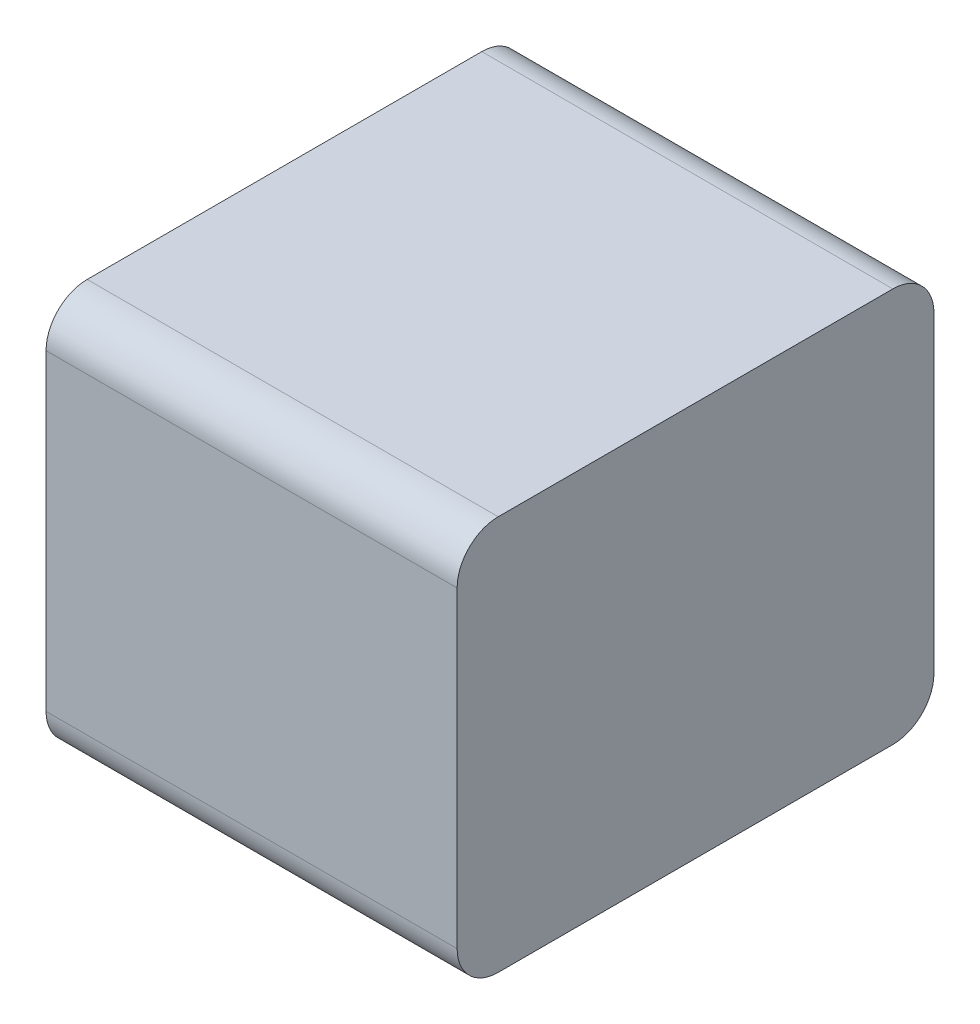
ISO-10303-21;
HEADER;
FILE_DESCRIPTION(('STEP AP214'),'2;1');
FILE_NAME('part.step','',(''),(''),'','','');
FILE_SCHEMA(('AUTOMOTIVE_DESIGN { 1 0 10303 214 1 1 1 1 }'));
ENDSEC;
DATA;
#1=APPLICATION_CONTEXT('core data for automotive mechanical design processes');
#2=APPLICATION_PROTOCOL_DEFINITION('international standard','automotive_design',2000,#1);
#3=PRODUCT_CONTEXT('',#1,'mechanical');
#4=PRODUCT('Part','Part','',(#3));
#5=PRODUCT_RELATED_PRODUCT_CATEGORY('part','',(#4));
#6=PRODUCT_DEFINITION_FORMATION('','',#4);
#7=PRODUCT_DEFINITION_CONTEXT('part definition',#1,'design');
#8=PRODUCT_DEFINITION('design','',#6,#7);
#9=PRODUCT_DEFINITION_SHAPE('','',#8);
#10=(LENGTH_UNIT() NAMED_UNIT(*) SI_UNIT(.MILLI.,.METRE.));
#11=(NAMED_UNIT(*) PLANE_ANGLE_UNIT() SI_UNIT($,.RADIAN.));
#12=(NAMED_UNIT(*) SI_UNIT($,.STERADIAN.) SOLID_ANGLE_UNIT());
#13=UNCERTAINTY_MEASURE_WITH_UNIT(LENGTH_MEASURE(1.E-05),#10,'distance_accuracy_value','');
#14=(GEOMETRIC_REPRESENTATION_CONTEXT(3) GLOBAL_UNCERTAINTY_ASSIGNED_CONTEXT((#13)) GLOBAL_UNIT_ASSIGNED_CONTEXT((#10,
#11,#12)) REPRESENTATION_CONTEXT('',''));
#15=CARTESIAN_POINT('',(0.,0.,0.));
#16=DIRECTION('',(0.,0.,1.));
#17=DIRECTION('',(1.,0.,0.));
#18=AXIS2_PLACEMENT_3D('',#15,#16,#17);
#19=CARTESIAN_POINT('',(-0.25,-0.24,0.3));
#20=DIRECTION('',(-1.,0.,0.));
#21=DIRECTION('',(0.,0.,1.));
#22=AXIS2_PLACEMENT_3D('',#19,#20,#21);
#23=PLANE('',#22);
#24=CARTESIAN_POINT('',(-0.25,0.19,0.54));
#25=DIRECTION('',(-1.,0.,0.));
#26=DIRECTION('',(0.,0.,1.));
#27=AXIS2_PLACEMENT_3D('',#24,#25,#26);
#28=CIRCLE('',#27,0.05);
#29=CARTESIAN_POINT('',(-0.25,0.24,0.54));
#30=VERTEX_POINT('',#29);
#31=CARTESIAN_POINT('',(-0.25,0.19,0.59));
#32=VERTEX_POINT('',#31);
#33=EDGE_CURVE('E94',#30,#32,#28,.F.);
#34=ORIENTED_EDGE('',*,*,#33,.F.);
#35=DIRECTION('',(0.,0.,1.));
#36=VECTOR('',#35,1.);
#37=CARTESIAN_POINT('',(-0.25,0.24,0.3));
#38=LINE('',#37,#36);
#39=CARTESIAN_POINT('',(-0.25,0.24,0.05999999999999));
#40=VERTEX_POINT('',#39);
#41=EDGE_CURVE('E105',#40,#30,#38,.T.);
#42=ORIENTED_EDGE('',*,*,#41,.F.);
#43=CARTESIAN_POINT('',(-0.25,0.19,0.0599999999999899));
#44=DIRECTION('',(1.,0.,0.));
#45=DIRECTION('',(0.,0.,-1.));
#46=AXIS2_PLACEMENT_3D('',#43,#44,#45);
#47=CIRCLE('',#46,0.05);
#48=CARTESIAN_POINT('',(-0.25,0.19,0.00999999999999141));
#49=VERTEX_POINT('',#48);
#50=EDGE_CURVE('E112',#49,#40,#47,.T.);
#51=ORIENTED_EDGE('',*,*,#50,.F.);
#52=DIRECTION('',(0.,1.,0.));
#53=VECTOR('',#52,1.);
#54=CARTESIAN_POINT('',(-0.25,-0.24,0.00999999999999291));
#55=LINE('',#54,#53);
#56=CARTESIAN_POINT('',(-0.25,-0.19,0.00999999999999291));
#57=VERTEX_POINT('',#56);
#58=EDGE_CURVE('E109',#57,#49,#55,.T.);
#59=ORIENTED_EDGE('',*,*,#58,.F.);
#60=CARTESIAN_POINT('',(-0.25,-0.19,0.0599999999999899));
#61=DIRECTION('',(1.,0.,0.));
#62=DIRECTION('',(0.,0.,-1.));
#63=AXIS2_PLACEMENT_3D('',#60,#61,#62);
#64=CIRCLE('',#63,0.05);
#65=CARTESIAN_POINT('',(-0.25,-0.24,0.0599999999999899));
#66=VERTEX_POINT('',#65);
#67=EDGE_CURVE('E127',#66,#57,#64,.T.);
#68=ORIENTED_EDGE('',*,*,#67,.F.);
#69=DIRECTION('',(0.,0.,1.));
#70=VECTOR('',#69,1.);
#71=CARTESIAN_POINT('',(-0.25,-0.24,0.3));
#72=LINE('',#71,#70);
#73=CARTESIAN_POINT('',(-0.25,-0.24,0.54));
#74=VERTEX_POINT('',#73);
#75=EDGE_CURVE('E85',#66,#74,#72,.T.);
#76=ORIENTED_EDGE('',*,*,#75,.T.);
#77=CARTESIAN_POINT('',(-0.25,-0.19,0.54));
#78=DIRECTION('',(-1.,0.,0.));
#79=DIRECTION('',(0.,0.,1.));
#80=AXIS2_PLACEMENT_3D('',#77,#78,#79);
#81=CIRCLE('',#80,0.05);
#82=CARTESIAN_POINT('',(-0.25,-0.19,0.59));
#83=VERTEX_POINT('',#82);
#84=EDGE_CURVE('E20',#83,#74,#81,.F.);
#85=ORIENTED_EDGE('',*,*,#84,.F.);
#86=DIRECTION('',(0.,1.,0.));
#87=VECTOR('',#86,1.);
#88=CARTESIAN_POINT('',(-0.25,-0.24,0.59));
#89=LINE('',#88,#87);
#90=EDGE_CURVE('E83',#32,#83,#89,.F.);
#91=ORIENTED_EDGE('',*,*,#90,.F.);
#92=EDGE_LOOP('',(#34,#42,#51,#59,#68,#76,#85,#91));
#93=FACE_BOUND('',#92,.T.);
#94=ADVANCED_FACE('F17',(#93),#23,.T.);
#95=CARTESIAN_POINT('',(0.,-0.19,0.54));
#96=DIRECTION('',(-1.,0.,0.));
#97=DIRECTION('',(0.,0.,1.));
#98=AXIS2_PLACEMENT_3D('',#95,#96,#97);
#99=CYLINDRICAL_SURFACE('',#98,0.05);
#100=ORIENTED_EDGE('',*,*,#84,.T.);
#101=DIRECTION('',(1.,0.,0.));
#102=VECTOR('',#101,1.);
#103=CARTESIAN_POINT('',(0.,-0.24,0.54));
#104=LINE('',#103,#102);
#105=CARTESIAN_POINT('',(0.249999999999999,-0.24,0.54));
#106=VERTEX_POINT('',#105);
#107=EDGE_CURVE('E103',#74,#106,#104,.T.);
#108=ORIENTED_EDGE('',*,*,#107,.T.);
#109=CARTESIAN_POINT('',(0.25,-0.19,0.54));
#110=DIRECTION('',(-1.,0.,0.));
#111=DIRECTION('',(0.,0.,1.));
#112=AXIS2_PLACEMENT_3D('',#109,#110,#111);
#113=CIRCLE('',#112,0.05);
#114=CARTESIAN_POINT('',(0.249999999999999,-0.19,0.59));
#115=VERTEX_POINT('',#114);
#116=EDGE_CURVE('E92',#115,#106,#113,.F.);
#117=ORIENTED_EDGE('',*,*,#116,.F.);
#118=DIRECTION('',(1.,0.,0.));
#119=VECTOR('',#118,1.);
#120=CARTESIAN_POINT('',(0.,-0.19,0.59));
#121=LINE('',#120,#119);
#122=EDGE_CURVE('E89',#83,#115,#121,.T.);
#123=ORIENTED_EDGE('',*,*,#122,.F.);
#124=EDGE_LOOP('',(#100,#108,#117,#123));
#125=FACE_BOUND('',#124,.T.);
#126=ADVANCED_FACE('F90',(#125),#99,.T.);
#127=CARTESIAN_POINT('',(0.,-0.24,0.3));
#128=DIRECTION('',(0.,1.,0.));
#129=DIRECTION('',(0.,0.,1.));
#130=AXIS2_PLACEMENT_3D('',#127,#128,#129);
#131=PLANE('',#130);
#132=ORIENTED_EDGE('',*,*,#107,.F.);
#133=ORIENTED_EDGE('',*,*,#75,.F.);
#134=DIRECTION('',(1.,0.,0.));
#135=VECTOR('',#134,1.);
#136=CARTESIAN_POINT('',(0.,-0.24,0.0599999999999899));
#137=LINE('',#136,#135);
#138=CARTESIAN_POINT('',(0.250000000000001,-0.24,0.05999999999999));
#139=VERTEX_POINT('',#138);
#140=EDGE_CURVE('E128',#139,#66,#137,.F.);
#141=ORIENTED_EDGE('',*,*,#140,.F.);
#142=DIRECTION('',(0.,0.,-1.));
#143=VECTOR('',#142,1.);
#144=CARTESIAN_POINT('',(0.25,-0.24,0.3));
#145=LINE('',#144,#143);
#146=EDGE_CURVE('E98',#106,#139,#145,.T.);
#147=ORIENTED_EDGE('',*,*,#146,.F.);
#148=EDGE_LOOP('',(#132,#133,#141,#147));
#149=FACE_BOUND('',#148,.T.);
#150=ADVANCED_FACE('F135',(#149),#131,.F.);
#151=CARTESIAN_POINT('',(0.,-0.19,0.05999999999999));
#152=DIRECTION('',(1.,0.,0.));
#153=DIRECTION('',(0.,0.,-1.));
#154=AXIS2_PLACEMENT_3D('',#151,#152,#153);
#155=CYLINDRICAL_SURFACE('',#154,0.05);
#156=CARTESIAN_POINT('',(0.25,-0.19,0.0599999999999901));
#157=DIRECTION('',(1.,0.,0.));
#158=DIRECTION('',(0.,0.,-1.));
#159=AXIS2_PLACEMENT_3D('',#156,#157,#158);
#160=CIRCLE('',#159,0.05);
#161=CARTESIAN_POINT('',(0.250000000000001,-0.19,0.00999999999999306));
#162=VERTEX_POINT('',#161);
#163=EDGE_CURVE('E122',#139,#162,#160,.T.);
#164=ORIENTED_EDGE('',*,*,#163,.F.);
#165=ORIENTED_EDGE('',*,*,#140,.T.);
#166=ORIENTED_EDGE('',*,*,#67,.T.);
#167=DIRECTION('',(-1.,0.,0.));
#168=VECTOR('',#167,1.);
#169=CARTESIAN_POINT('',(0.,-0.19,0.009999999999993));
#170=LINE('',#169,#168);
#171=EDGE_CURVE('E113',#162,#57,#170,.T.);
#172=ORIENTED_EDGE('',*,*,#171,.F.);
#173=EDGE_LOOP('',(#164,#165,#166,#172));
#174=FACE_BOUND('',#173,.T.);
#175=ADVANCED_FACE('F156',(#174),#155,.T.);
#176=CARTESIAN_POINT('',(0.,-0.24,0.009999999999993));
#177=DIRECTION('',(0.,0.,-1.));
#178=DIRECTION('',(-1.,0.,0.));
#179=AXIS2_PLACEMENT_3D('',#176,#177,#178);
#180=PLANE('',#179);
#181=ORIENTED_EDGE('',*,*,#171,.T.);
#182=ORIENTED_EDGE('',*,*,#58,.T.);
#183=DIRECTION('',(1.,0.,0.));
#184=VECTOR('',#183,1.);
#185=CARTESIAN_POINT('',(0.,0.19,0.00999999999999));
#186=LINE('',#185,#184);
#187=CARTESIAN_POINT('',(0.25,0.19,0.00999999999999153));
#188=VERTEX_POINT('',#187);
#189=EDGE_CURVE('E126',#188,#49,#186,.F.);
#190=ORIENTED_EDGE('',*,*,#189,.F.);
#191=DIRECTION('',(0.,1.,0.));
#192=VECTOR('',#191,1.);
#193=CARTESIAN_POINT('',(0.250000000000001,-0.24,0.00999999999999298));
#194=LINE('',#193,#192);
#195=EDGE_CURVE('E121',#162,#188,#194,.T.);
#196=ORIENTED_EDGE('',*,*,#195,.F.);
#197=EDGE_LOOP('',(#181,#182,#190,#196));
#198=FACE_BOUND('',#197,.T.);
#199=ADVANCED_FACE('F154',(#198),#180,.T.);
#200=CARTESIAN_POINT('',(0.,0.19,0.05999999999999));
#201=DIRECTION('',(1.,0.,0.));
#202=DIRECTION('',(0.,0.,-1.));
#203=AXIS2_PLACEMENT_3D('',#200,#201,#202);
#204=CYLINDRICAL_SURFACE('',#203,0.05);
#205=CARTESIAN_POINT('',(0.25,0.19,0.0599999999999901));
#206=DIRECTION('',(1.,0.,0.));
#207=DIRECTION('',(0.,0.,-1.));
#208=AXIS2_PLACEMENT_3D('',#205,#206,#207);
#209=CIRCLE('',#208,0.05);
#210=CARTESIAN_POINT('',(0.250000000000001,0.24,0.05999999999999));
#211=VERTEX_POINT('',#210);
#212=EDGE_CURVE('E118',#188,#211,#209,.T.);
#213=ORIENTED_EDGE('',*,*,#212,.F.);
#214=ORIENTED_EDGE('',*,*,#189,.T.);
#215=ORIENTED_EDGE('',*,*,#50,.T.);
#216=DIRECTION('',(1.,0.,0.));
#217=VECTOR('',#216,1.);
#218=CARTESIAN_POINT('',(0.,0.24,0.05999999999999));
#219=LINE('',#218,#217);
#220=EDGE_CURVE('E108',#211,#40,#219,.F.);
#221=ORIENTED_EDGE('',*,*,#220,.F.);
#222=EDGE_LOOP('',(#213,#214,#215,#221));
#223=FACE_BOUND('',#222,.T.);
#224=ADVANCED_FACE('F161',(#223),#204,.T.);
#225=CARTESIAN_POINT('',(0.,0.24,0.3));
#226=DIRECTION('',(0.,1.,0.));
#227=DIRECTION('',(0.,0.,1.));
#228=AXIS2_PLACEMENT_3D('',#225,#226,#227);
#229=PLANE('',#228);
#230=ORIENTED_EDGE('',*,*,#220,.T.);
#231=ORIENTED_EDGE('',*,*,#41,.T.);
#232=DIRECTION('',(-1.,0.,0.));
#233=VECTOR('',#232,1.);
#234=CARTESIAN_POINT('',(0.,0.24,0.54));
#235=LINE('',#234,#233);
#236=CARTESIAN_POINT('',(0.249999999999999,0.24,0.54));
#237=VERTEX_POINT('',#236);
#238=EDGE_CURVE('E107',#237,#30,#235,.T.);
#239=ORIENTED_EDGE('',*,*,#238,.F.);
#240=DIRECTION('',(0.,0.,-1.));
#241=VECTOR('',#240,1.);
#242=CARTESIAN_POINT('',(0.25,0.24,0.3));
#243=LINE('',#242,#241);
#244=EDGE_CURVE('E117',#211,#237,#243,.F.);
#245=ORIENTED_EDGE('',*,*,#244,.F.);
#246=EDGE_LOOP('',(#230,#231,#239,#245));
#247=FACE_BOUND('',#246,.T.);
#248=ADVANCED_FACE('F163',(#247),#229,.T.);
#249=CARTESIAN_POINT('',(0.,0.19,0.54));
#250=DIRECTION('',(-1.,0.,0.));
#251=DIRECTION('',(0.,0.,1.));
#252=AXIS2_PLACEMENT_3D('',#249,#250,#251);
#253=CYLINDRICAL_SURFACE('',#252,0.05);
#254=ORIENTED_EDGE('',*,*,#33,.T.);
#255=DIRECTION('',(1.,0.,0.));
#256=VECTOR('',#255,1.);
#257=CARTESIAN_POINT('',(0.,0.19,0.59));
#258=LINE('',#257,#256);
#259=CARTESIAN_POINT('',(0.249999999999999,0.19,0.59));
#260=VERTEX_POINT('',#259);
#261=EDGE_CURVE('E35',#260,#32,#258,.F.);
#262=ORIENTED_EDGE('',*,*,#261,.F.);
#263=CARTESIAN_POINT('',(0.25,0.19,0.54));
#264=DIRECTION('',(-1.,0.,0.));
#265=DIRECTION('',(0.,0.,1.));
#266=AXIS2_PLACEMENT_3D('',#263,#264,#265);
#267=CIRCLE('',#266,0.05);
#268=EDGE_CURVE('E26',#237,#260,#267,.F.);
#269=ORIENTED_EDGE('',*,*,#268,.F.);
#270=ORIENTED_EDGE('',*,*,#238,.T.);
#271=EDGE_LOOP('',(#254,#262,#269,#270));
#272=FACE_BOUND('',#271,.T.);
#273=ADVANCED_FACE('F143',(#272),#253,.T.);
#274=CARTESIAN_POINT('',(0.,-0.24,0.59));
#275=DIRECTION('',(0.,0.,1.));
#276=DIRECTION('',(1.,0.,0.));
#277=AXIS2_PLACEMENT_3D('',#274,#275,#276);
#278=PLANE('',#277);
#279=ORIENTED_EDGE('',*,*,#261,.T.);
#280=ORIENTED_EDGE('',*,*,#90,.T.);
#281=ORIENTED_EDGE('',*,*,#122,.T.);
#282=DIRECTION('',(0.,1.,0.));
#283=VECTOR('',#282,1.);
#284=CARTESIAN_POINT('',(0.249999999999999,-0.24,0.59));
#285=LINE('',#284,#283);
#286=EDGE_CURVE('E11',#260,#115,#285,.F.);
#287=ORIENTED_EDGE('',*,*,#286,.F.);
#288=EDGE_LOOP('',(#279,#280,#281,#287));
#289=FACE_BOUND('',#288,.T.);
#290=ADVANCED_FACE('F96',(#289),#278,.T.);
#291=CARTESIAN_POINT('',(0.25,-0.24,0.3));
#292=DIRECTION('',(1.,0.,0.));
#293=DIRECTION('',(0.,0.,-1.));
#294=AXIS2_PLACEMENT_3D('',#291,#292,#293);
#295=PLANE('',#294);
#296=ORIENTED_EDGE('',*,*,#268,.T.);
#297=ORIENTED_EDGE('',*,*,#286,.T.);
#298=ORIENTED_EDGE('',*,*,#116,.T.);
#299=ORIENTED_EDGE('',*,*,#146,.T.);
#300=ORIENTED_EDGE('',*,*,#163,.T.);
#301=ORIENTED_EDGE('',*,*,#195,.T.);
#302=ORIENTED_EDGE('',*,*,#212,.T.);
#303=ORIENTED_EDGE('',*,*,#244,.T.);
#304=EDGE_LOOP('',(#296,#297,#298,#299,#300,#301,#302,#303));
#305=FACE_BOUND('',#304,.T.);
#306=ADVANCED_FACE('F139',(#305),#295,.T.);
#307=CLOSED_SHELL('',(#94,#126,#150,#175,#199,#224,#248,#273,#290,#306));
#308=MANIFOLD_SOLID_BREP('B1',#307);
#309=ADVANCED_BREP_SHAPE_REPRESENTATION('',(#18,#308),#14);
#310=SHAPE_DEFINITION_REPRESENTATION(#9,#309);
ENDSEC;
END-ISO-10303-21;
